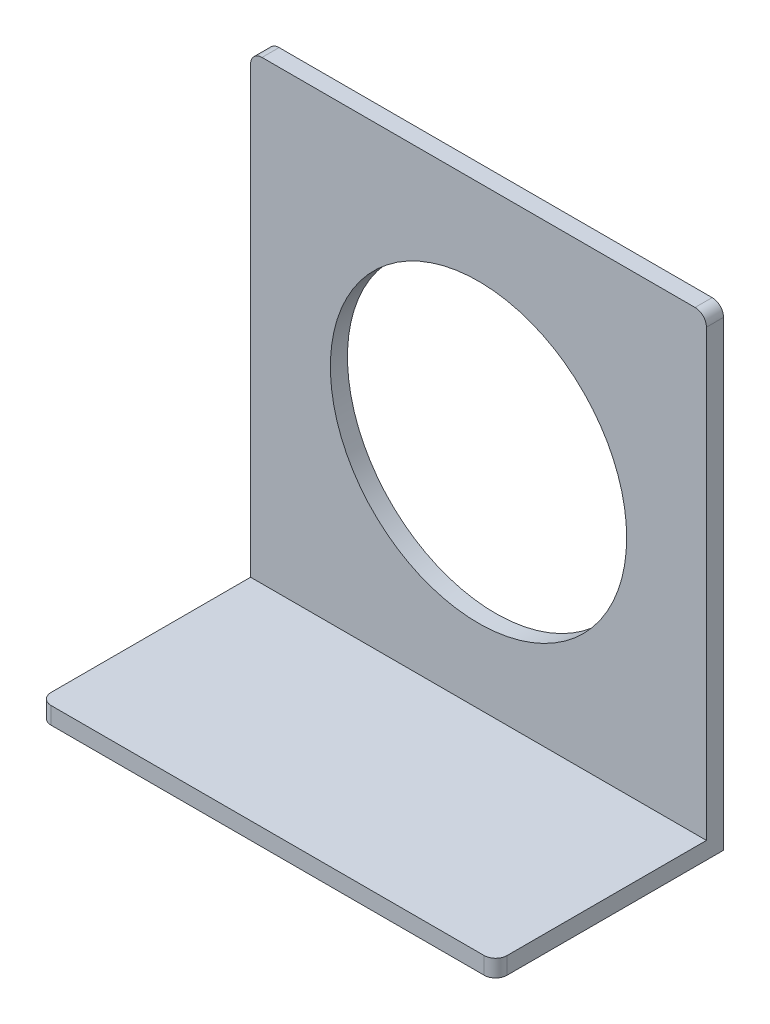
ISO-10303-21;
HEADER;
FILE_DESCRIPTION(('STEP AP214'),'2;1');
FILE_NAME('part.step','',(''),(''),'','','');
FILE_SCHEMA(('AUTOMOTIVE_DESIGN { 1 0 10303 214 1 1 1 1 }'));
ENDSEC;
DATA;
#1=APPLICATION_CONTEXT('core data for automotive mechanical design processes');
#2=APPLICATION_PROTOCOL_DEFINITION('international standard','automotive_design',2000,#1);
#3=PRODUCT_CONTEXT('',#1,'mechanical');
#4=PRODUCT('Part','Part','',(#3));
#5=PRODUCT_RELATED_PRODUCT_CATEGORY('part','',(#4));
#6=PRODUCT_DEFINITION_FORMATION('','',#4);
#7=PRODUCT_DEFINITION_CONTEXT('part definition',#1,'design');
#8=PRODUCT_DEFINITION('design','',#6,#7);
#9=PRODUCT_DEFINITION_SHAPE('','',#8);
#10=(LENGTH_UNIT() NAMED_UNIT(*) SI_UNIT(.MILLI.,.METRE.));
#11=(NAMED_UNIT(*) PLANE_ANGLE_UNIT() SI_UNIT($,.RADIAN.));
#12=(NAMED_UNIT(*) SI_UNIT($,.STERADIAN.) SOLID_ANGLE_UNIT());
#13=UNCERTAINTY_MEASURE_WITH_UNIT(LENGTH_MEASURE(1.E-05),#10,'distance_accuracy_value','');
#14=(GEOMETRIC_REPRESENTATION_CONTEXT(3) GLOBAL_UNCERTAINTY_ASSIGNED_CONTEXT((#13)) GLOBAL_UNIT_ASSIGNED_CONTEXT((#10,
#11,#12)) REPRESENTATION_CONTEXT('',''));
#15=CARTESIAN_POINT('',(0.,0.,0.));
#16=DIRECTION('',(0.,0.,1.));
#17=DIRECTION('',(1.,0.,0.));
#18=AXIS2_PLACEMENT_3D('',#15,#16,#17);
#19=CARTESIAN_POINT('',(0.,0.,1.5));
#20=DIRECTION('',(0.,0.,-1.));
#21=DIRECTION('',(-1.,0.,0.));
#22=AXIS2_PLACEMENT_3D('',#19,#20,#21);
#23=PLANE('',#22);
#24=CARTESIAN_POINT('',(20.,21.,1.5));
#25=DIRECTION('',(0.,0.,1.));
#26=DIRECTION('',(1.,0.,0.));
#27=AXIS2_PLACEMENT_3D('',#24,#25,#26);
#28=CIRCLE('',#27,13.);
#29=CARTESIAN_POINT('',(33.,21.,1.5));
#30=VERTEX_POINT('',#29);
#31=EDGE_CURVE('E149',#30,#30,#28,.T.);
#32=ORIENTED_EDGE('',*,*,#31,.F.);
#33=EDGE_LOOP('',(#32));
#34=FACE_BOUND('',#33,.T.);
#35=DIRECTION('',(0.,1.,0.));
#36=VECTOR('',#35,1.);
#37=CARTESIAN_POINT('',(40.,0.,1.5));
#38=LINE('',#37,#36);
#39=CARTESIAN_POINT('',(40.,1.5,1.5));
#40=VERTEX_POINT('',#39);
#41=CARTESIAN_POINT('',(40.,40.5,1.5));
#42=VERTEX_POINT('',#41);
#43=EDGE_CURVE('E134',#40,#42,#38,.T.);
#44=ORIENTED_EDGE('',*,*,#43,.T.);
#45=CARTESIAN_POINT('',(39.,40.5,1.5));
#46=DIRECTION('',(0.,0.,-1.));
#47=DIRECTION('',(-1.,0.,0.));
#48=AXIS2_PLACEMENT_3D('',#45,#46,#47);
#49=CIRCLE('',#48,1.);
#50=CARTESIAN_POINT('',(39.,41.5,1.5));
#51=VERTEX_POINT('',#50);
#52=EDGE_CURVE('E206',#42,#51,#49,.F.);
#53=ORIENTED_EDGE('',*,*,#52,.T.);
#54=DIRECTION('',(-1.,0.,0.));
#55=VECTOR('',#54,1.);
#56=CARTESIAN_POINT('',(0.,41.5,1.5));
#57=LINE('',#56,#55);
#58=CARTESIAN_POINT('',(1.,41.5,1.5));
#59=VERTEX_POINT('',#58);
#60=EDGE_CURVE('E158',#51,#59,#57,.T.);
#61=ORIENTED_EDGE('',*,*,#60,.T.);
#62=CARTESIAN_POINT('',(1.,40.5,1.5));
#63=DIRECTION('',(0.,0.,-1.));
#64=DIRECTION('',(-1.,0.,0.));
#65=AXIS2_PLACEMENT_3D('',#62,#63,#64);
#66=CIRCLE('',#65,1.);
#67=CARTESIAN_POINT('',(0.,40.5,1.5));
#68=VERTEX_POINT('',#67);
#69=EDGE_CURVE('E132',#59,#68,#66,.F.);
#70=ORIENTED_EDGE('',*,*,#69,.T.);
#71=DIRECTION('',(0.,-1.,0.));
#72=VECTOR('',#71,1.);
#73=CARTESIAN_POINT('',(0.,0.,1.5));
#74=LINE('',#73,#72);
#75=CARTESIAN_POINT('',(0.,1.5,1.5));
#76=VERTEX_POINT('',#75);
#77=EDGE_CURVE('E117',#68,#76,#74,.T.);
#78=ORIENTED_EDGE('',*,*,#77,.T.);
#79=DIRECTION('',(-1.,0.,0.));
#80=VECTOR('',#79,1.);
#81=CARTESIAN_POINT('',(0.,1.5,1.5));
#82=LINE('',#81,#80);
#83=EDGE_CURVE('E129',#40,#76,#82,.T.);
#84=ORIENTED_EDGE('',*,*,#83,.F.);
#85=EDGE_LOOP('',(#44,#53,#61,#70,#78,#84));
#86=FACE_BOUND('',#85,.T.);
#87=ADVANCED_FACE('F39',(#34,#86),#23,.F.);
#88=CARTESIAN_POINT('',(0.,0.,1.5));
#89=DIRECTION('',(1.,0.,0.));
#90=DIRECTION('',(0.,0.,-1.));
#91=AXIS2_PLACEMENT_3D('',#88,#89,#90);
#92=PLANE('',#91);
#93=DIRECTION('',(0.,0.,-1.));
#94=VECTOR('',#93,1.);
#95=CARTESIAN_POINT('',(0.,0.,1.5));
#96=LINE('',#95,#94);
#97=CARTESIAN_POINT('',(0.,0.,19.));
#98=VERTEX_POINT('',#97);
#99=CARTESIAN_POINT('',(0.,0.,0.));
#100=VERTEX_POINT('',#99);
#101=EDGE_CURVE('E177',#98,#100,#96,.T.);
#102=ORIENTED_EDGE('',*,*,#101,.F.);
#103=DIRECTION('',(0.,-1.,0.));
#104=VECTOR('',#103,1.);
#105=CARTESIAN_POINT('',(0.,0.,19.));
#106=LINE('',#105,#104);
#107=CARTESIAN_POINT('',(0.,1.5,19.));
#108=VERTEX_POINT('',#107);
#109=EDGE_CURVE('E11',#98,#108,#106,.F.);
#110=ORIENTED_EDGE('',*,*,#109,.T.);
#111=DIRECTION('',(0.,0.,-1.));
#112=VECTOR('',#111,1.);
#113=CARTESIAN_POINT('',(0.,1.5,20.));
#114=LINE('',#113,#112);
#115=EDGE_CURVE('E113',#108,#76,#114,.T.);
#116=ORIENTED_EDGE('',*,*,#115,.T.);
#117=ORIENTED_EDGE('',*,*,#77,.F.);
#118=DIRECTION('',(0.,0.,-1.));
#119=VECTOR('',#118,1.);
#120=CARTESIAN_POINT('',(0.,40.5,1.5));
#121=LINE('',#120,#119);
#122=CARTESIAN_POINT('',(0.,40.5,0.));
#123=VERTEX_POINT('',#122);
#124=EDGE_CURVE('E180',#68,#123,#121,.T.);
#125=ORIENTED_EDGE('',*,*,#124,.T.);
#126=DIRECTION('',(0.,-1.,0.));
#127=VECTOR('',#126,1.);
#128=CARTESIAN_POINT('',(0.,0.,0.));
#129=LINE('',#128,#127);
#130=EDGE_CURVE('E154',#123,#100,#129,.T.);
#131=ORIENTED_EDGE('',*,*,#130,.T.);
#132=EDGE_LOOP('',(#102,#110,#116,#117,#125,#131));
#133=FACE_BOUND('',#132,.T.);
#134=ADVANCED_FACE('F115',(#133),#92,.F.);
#135=CARTESIAN_POINT('',(0.,0.,1.5));
#136=DIRECTION('',(0.,1.,0.));
#137=DIRECTION('',(0.,0.,1.));
#138=AXIS2_PLACEMENT_3D('',#135,#136,#137);
#139=PLANE('',#138);
#140=DIRECTION('',(0.,0.,-1.));
#141=VECTOR('',#140,1.);
#142=CARTESIAN_POINT('',(40.,0.,1.5));
#143=LINE('',#142,#141);
#144=CARTESIAN_POINT('',(40.,0.,19.));
#145=VERTEX_POINT('',#144);
#146=CARTESIAN_POINT('',(40.,0.,0.));
#147=VERTEX_POINT('',#146);
#148=EDGE_CURVE('E161',#145,#147,#143,.T.);
#149=ORIENTED_EDGE('',*,*,#148,.F.);
#150=CARTESIAN_POINT('',(39.,0.,19.));
#151=DIRECTION('',(0.,1.,0.));
#152=DIRECTION('',(0.,0.,1.));
#153=AXIS2_PLACEMENT_3D('',#150,#151,#152);
#154=CIRCLE('',#153,1.);
#155=CARTESIAN_POINT('',(39.,0.,20.));
#156=VERTEX_POINT('',#155);
#157=EDGE_CURVE('E48',#145,#156,#154,.F.);
#158=ORIENTED_EDGE('',*,*,#157,.T.);
#159=DIRECTION('',(1.,0.,0.));
#160=VECTOR('',#159,1.);
#161=CARTESIAN_POINT('',(0.,0.,20.));
#162=LINE('',#161,#160);
#163=CARTESIAN_POINT('',(1.,0.,20.));
#164=VERTEX_POINT('',#163);
#165=EDGE_CURVE('E141',#164,#156,#162,.T.);
#166=ORIENTED_EDGE('',*,*,#165,.F.);
#167=CARTESIAN_POINT('',(1.,0.,19.));
#168=DIRECTION('',(0.,1.,0.));
#169=DIRECTION('',(0.,0.,1.));
#170=AXIS2_PLACEMENT_3D('',#167,#168,#169);
#171=CIRCLE('',#170,1.);
#172=EDGE_CURVE('E55',#164,#98,#171,.F.);
#173=ORIENTED_EDGE('',*,*,#172,.T.);
#174=ORIENTED_EDGE('',*,*,#101,.T.);
#175=DIRECTION('',(1.,0.,0.));
#176=VECTOR('',#175,1.);
#177=CARTESIAN_POINT('',(0.,0.,0.));
#178=LINE('',#177,#176);
#179=EDGE_CURVE('E165',#100,#147,#178,.T.);
#180=ORIENTED_EDGE('',*,*,#179,.T.);
#181=EDGE_LOOP('',(#149,#158,#166,#173,#174,#180));
#182=FACE_BOUND('',#181,.T.);
#183=ADVANCED_FACE('F227',(#182),#139,.F.);
#184=CARTESIAN_POINT('',(40.,0.,1.5));
#185=DIRECTION('',(-1.,0.,0.));
#186=DIRECTION('',(0.,0.,1.));
#187=AXIS2_PLACEMENT_3D('',#184,#185,#186);
#188=PLANE('',#187);
#189=DIRECTION('',(0.,1.,0.));
#190=VECTOR('',#189,1.);
#191=CARTESIAN_POINT('',(40.,0.,0.));
#192=LINE('',#191,#190);
#193=CARTESIAN_POINT('',(40.,40.5,0.));
#194=VERTEX_POINT('',#193);
#195=EDGE_CURVE('E169',#147,#194,#192,.T.);
#196=ORIENTED_EDGE('',*,*,#195,.T.);
#197=DIRECTION('',(0.,0.,-1.));
#198=VECTOR('',#197,1.);
#199=CARTESIAN_POINT('',(40.,40.5,1.5));
#200=LINE('',#199,#198);
#201=EDGE_CURVE('E203',#194,#42,#200,.F.);
#202=ORIENTED_EDGE('',*,*,#201,.T.);
#203=ORIENTED_EDGE('',*,*,#43,.F.);
#204=DIRECTION('',(0.,0.,-1.));
#205=VECTOR('',#204,1.);
#206=CARTESIAN_POINT('',(40.,1.5,20.));
#207=LINE('',#206,#205);
#208=CARTESIAN_POINT('',(40.,1.5,19.));
#209=VERTEX_POINT('',#208);
#210=EDGE_CURVE('E123',#209,#40,#207,.T.);
#211=ORIENTED_EDGE('',*,*,#210,.F.);
#212=DIRECTION('',(0.,1.,0.));
#213=VECTOR('',#212,1.);
#214=CARTESIAN_POINT('',(40.,0.,19.));
#215=LINE('',#214,#213);
#216=EDGE_CURVE('E200',#209,#145,#215,.F.);
#217=ORIENTED_EDGE('',*,*,#216,.T.);
#218=ORIENTED_EDGE('',*,*,#148,.T.);
#219=EDGE_LOOP('',(#196,#202,#203,#211,#217,#218));
#220=FACE_BOUND('',#219,.T.);
#221=ADVANCED_FACE('F237',(#220),#188,.F.);
#222=CARTESIAN_POINT('',(0.,41.5,1.5));
#223=DIRECTION('',(0.,-1.,0.));
#224=DIRECTION('',(0.,0.,-1.));
#225=AXIS2_PLACEMENT_3D('',#222,#223,#224);
#226=PLANE('',#225);
#227=ORIENTED_EDGE('',*,*,#60,.F.);
#228=DIRECTION('',(0.,0.,-1.));
#229=VECTOR('',#228,1.);
#230=CARTESIAN_POINT('',(39.,41.5,1.5));
#231=LINE('',#230,#229);
#232=CARTESIAN_POINT('',(39.,41.5,0.));
#233=VERTEX_POINT('',#232);
#234=EDGE_CURVE('E193',#51,#233,#231,.T.);
#235=ORIENTED_EDGE('',*,*,#234,.T.);
#236=DIRECTION('',(-1.,0.,0.));
#237=VECTOR('',#236,1.);
#238=CARTESIAN_POINT('',(0.,41.5,0.));
#239=LINE('',#238,#237);
#240=CARTESIAN_POINT('',(1.,41.5,0.));
#241=VERTEX_POINT('',#240);
#242=EDGE_CURVE('E135',#233,#241,#239,.T.);
#243=ORIENTED_EDGE('',*,*,#242,.T.);
#244=DIRECTION('',(0.,0.,-1.));
#245=VECTOR('',#244,1.);
#246=CARTESIAN_POINT('',(1.,41.5,1.5));
#247=LINE('',#246,#245);
#248=EDGE_CURVE('E187',#241,#59,#247,.F.);
#249=ORIENTED_EDGE('',*,*,#248,.T.);
#250=EDGE_LOOP('',(#227,#235,#243,#249));
#251=FACE_BOUND('',#250,.T.);
#252=ADVANCED_FACE('F246',(#251),#226,.F.);
#253=CARTESIAN_POINT('',(0.,0.,0.));
#254=DIRECTION('',(0.,0.,-1.));
#255=DIRECTION('',(-1.,0.,0.));
#256=AXIS2_PLACEMENT_3D('',#253,#254,#255);
#257=PLANE('',#256);
#258=CARTESIAN_POINT('',(20.,21.,0.));
#259=DIRECTION('',(0.,0.,1.));
#260=DIRECTION('',(1.,0.,0.));
#261=AXIS2_PLACEMENT_3D('',#258,#259,#260);
#262=CIRCLE('',#261,13.);
#263=CARTESIAN_POINT('',(33.,21.,0.));
#264=VERTEX_POINT('',#263);
#265=EDGE_CURVE('E142',#264,#264,#262,.T.);
#266=ORIENTED_EDGE('',*,*,#265,.T.);
#267=EDGE_LOOP('',(#266));
#268=FACE_BOUND('',#267,.T.);
#269=ORIENTED_EDGE('',*,*,#242,.F.);
#270=CARTESIAN_POINT('',(39.,40.5,0.));
#271=DIRECTION('',(0.,0.,-1.));
#272=DIRECTION('',(-1.,0.,0.));
#273=AXIS2_PLACEMENT_3D('',#270,#271,#272);
#274=CIRCLE('',#273,1.);
#275=EDGE_CURVE('E197',#233,#194,#274,.T.);
#276=ORIENTED_EDGE('',*,*,#275,.T.);
#277=ORIENTED_EDGE('',*,*,#195,.F.);
#278=ORIENTED_EDGE('',*,*,#179,.F.);
#279=ORIENTED_EDGE('',*,*,#130,.F.);
#280=CARTESIAN_POINT('',(1.,40.5,0.));
#281=DIRECTION('',(0.,0.,-1.));
#282=DIRECTION('',(-1.,0.,0.));
#283=AXIS2_PLACEMENT_3D('',#280,#281,#282);
#284=CIRCLE('',#283,1.);
#285=EDGE_CURVE('E183',#123,#241,#284,.T.);
#286=ORIENTED_EDGE('',*,*,#285,.T.);
#287=EDGE_LOOP('',(#269,#276,#277,#278,#279,#286));
#288=FACE_BOUND('',#287,.T.);
#289=ADVANCED_FACE('F248',(#268,#288),#257,.T.);
#290=CARTESIAN_POINT('',(0.,1.5,20.));
#291=DIRECTION('',(0.,-1.,0.));
#292=DIRECTION('',(0.,0.,-1.));
#293=AXIS2_PLACEMENT_3D('',#290,#291,#292);
#294=PLANE('',#293);
#295=DIRECTION('',(-1.,0.,0.));
#296=VECTOR('',#295,1.);
#297=CARTESIAN_POINT('',(0.,1.5,20.));
#298=LINE('',#297,#296);
#299=CARTESIAN_POINT('',(39.,1.5,20.));
#300=VERTEX_POINT('',#299);
#301=CARTESIAN_POINT('',(1.,1.5,20.));
#302=VERTEX_POINT('',#301);
#303=EDGE_CURVE('E124',#300,#302,#298,.T.);
#304=ORIENTED_EDGE('',*,*,#303,.F.);
#305=CARTESIAN_POINT('',(39.,1.5,19.));
#306=DIRECTION('',(0.,-1.,0.));
#307=DIRECTION('',(0.,0.,-1.));
#308=AXIS2_PLACEMENT_3D('',#305,#306,#307);
#309=CIRCLE('',#308,1.);
#310=EDGE_CURVE('E220',#300,#209,#309,.F.);
#311=ORIENTED_EDGE('',*,*,#310,.T.);
#312=ORIENTED_EDGE('',*,*,#210,.T.);
#313=ORIENTED_EDGE('',*,*,#83,.T.);
#314=ORIENTED_EDGE('',*,*,#115,.F.);
#315=CARTESIAN_POINT('',(1.,1.5,19.));
#316=DIRECTION('',(0.,-1.,0.));
#317=DIRECTION('',(0.,0.,-1.));
#318=AXIS2_PLACEMENT_3D('',#315,#316,#317);
#319=CIRCLE('',#318,1.);
#320=EDGE_CURVE('E217',#108,#302,#319,.F.);
#321=ORIENTED_EDGE('',*,*,#320,.T.);
#322=EDGE_LOOP('',(#304,#311,#312,#313,#314,#321));
#323=FACE_BOUND('',#322,.T.);
#324=ADVANCED_FACE('F138',(#323),#294,.F.);
#325=CARTESIAN_POINT('',(0.,0.,20.));
#326=DIRECTION('',(0.,0.,-1.));
#327=DIRECTION('',(-1.,0.,0.));
#328=AXIS2_PLACEMENT_3D('',#325,#326,#327);
#329=PLANE('',#328);
#330=ORIENTED_EDGE('',*,*,#165,.T.);
#331=DIRECTION('',(0.,1.,0.));
#332=VECTOR('',#331,1.);
#333=CARTESIAN_POINT('',(39.,0.,20.));
#334=LINE('',#333,#332);
#335=EDGE_CURVE('E213',#156,#300,#334,.T.);
#336=ORIENTED_EDGE('',*,*,#335,.T.);
#337=ORIENTED_EDGE('',*,*,#303,.T.);
#338=DIRECTION('',(0.,-1.,0.));
#339=VECTOR('',#338,1.);
#340=CARTESIAN_POINT('',(1.,0.,20.));
#341=LINE('',#340,#339);
#342=EDGE_CURVE('E209',#302,#164,#341,.T.);
#343=ORIENTED_EDGE('',*,*,#342,.T.);
#344=EDGE_LOOP('',(#330,#336,#337,#343));
#345=FACE_BOUND('',#344,.T.);
#346=ADVANCED_FACE('F232',(#345),#329,.F.);
#347=CARTESIAN_POINT('',(1.,40.5,1.5));
#348=DIRECTION('',(0.,0.,-1.));
#349=DIRECTION('',(-1.,0.,0.));
#350=AXIS2_PLACEMENT_3D('',#347,#348,#349);
#351=CYLINDRICAL_SURFACE('',#350,1.);
#352=ORIENTED_EDGE('',*,*,#69,.F.);
#353=ORIENTED_EDGE('',*,*,#248,.F.);
#354=ORIENTED_EDGE('',*,*,#285,.F.);
#355=ORIENTED_EDGE('',*,*,#124,.F.);
#356=EDGE_LOOP('',(#352,#353,#354,#355));
#357=FACE_BOUND('',#356,.T.);
#358=ADVANCED_FACE('F254',(#357),#351,.T.);
#359=CARTESIAN_POINT('',(39.,40.5,1.5));
#360=DIRECTION('',(0.,0.,-1.));
#361=DIRECTION('',(-1.,0.,0.));
#362=AXIS2_PLACEMENT_3D('',#359,#360,#361);
#363=CYLINDRICAL_SURFACE('',#362,1.);
#364=ORIENTED_EDGE('',*,*,#52,.F.);
#365=ORIENTED_EDGE('',*,*,#201,.F.);
#366=ORIENTED_EDGE('',*,*,#275,.F.);
#367=ORIENTED_EDGE('',*,*,#234,.F.);
#368=EDGE_LOOP('',(#364,#365,#366,#367));
#369=FACE_BOUND('',#368,.T.);
#370=ADVANCED_FACE('F243',(#369),#363,.T.);
#371=CARTESIAN_POINT('',(39.,0.,19.));
#372=DIRECTION('',(0.,1.,0.));
#373=DIRECTION('',(0.,0.,1.));
#374=AXIS2_PLACEMENT_3D('',#371,#372,#373);
#375=CYLINDRICAL_SURFACE('',#374,1.);
#376=ORIENTED_EDGE('',*,*,#157,.F.);
#377=ORIENTED_EDGE('',*,*,#216,.F.);
#378=ORIENTED_EDGE('',*,*,#310,.F.);
#379=ORIENTED_EDGE('',*,*,#335,.F.);
#380=EDGE_LOOP('',(#376,#377,#378,#379));
#381=FACE_BOUND('',#380,.T.);
#382=ADVANCED_FACE('F235',(#381),#375,.T.);
#383=CARTESIAN_POINT('',(1.,0.,19.));
#384=DIRECTION('',(0.,-1.,0.));
#385=DIRECTION('',(0.,0.,-1.));
#386=AXIS2_PLACEMENT_3D('',#383,#384,#385);
#387=CYLINDRICAL_SURFACE('',#386,1.);
#388=ORIENTED_EDGE('',*,*,#320,.F.);
#389=ORIENTED_EDGE('',*,*,#109,.F.);
#390=ORIENTED_EDGE('',*,*,#172,.F.);
#391=ORIENTED_EDGE('',*,*,#342,.F.);
#392=EDGE_LOOP('',(#388,#389,#390,#391));
#393=FACE_BOUND('',#392,.T.);
#394=ADVANCED_FACE('F41',(#393),#387,.T.);
#395=CARTESIAN_POINT('',(20.,21.,0.));
#396=DIRECTION('',(0.,0.,1.));
#397=DIRECTION('',(1.,0.,0.));
#398=AXIS2_PLACEMENT_3D('',#395,#396,#397);
#399=CYLINDRICAL_SURFACE('',#398,13.);
#400=ORIENTED_EDGE('',*,*,#265,.F.);
#401=EDGE_LOOP('',(#400));
#402=FACE_BOUND('',#401,.T.);
#403=ORIENTED_EDGE('',*,*,#31,.T.);
#404=EDGE_LOOP('',(#403));
#405=FACE_BOUND('',#404,.T.);
#406=ADVANCED_FACE('F258',(#402,#405),#399,.F.);
#407=CLOSED_SHELL('',(#87,#134,#183,#221,#252,#289,#324,#346,#358,#370,#382,#394,#406));
#408=MANIFOLD_SOLID_BREP('B2',#407);
#409=ADVANCED_BREP_SHAPE_REPRESENTATION('',(#18,#408),#14);
#410=SHAPE_DEFINITION_REPRESENTATION(#9,#409);
ENDSEC;
END-ISO-10303-21;
